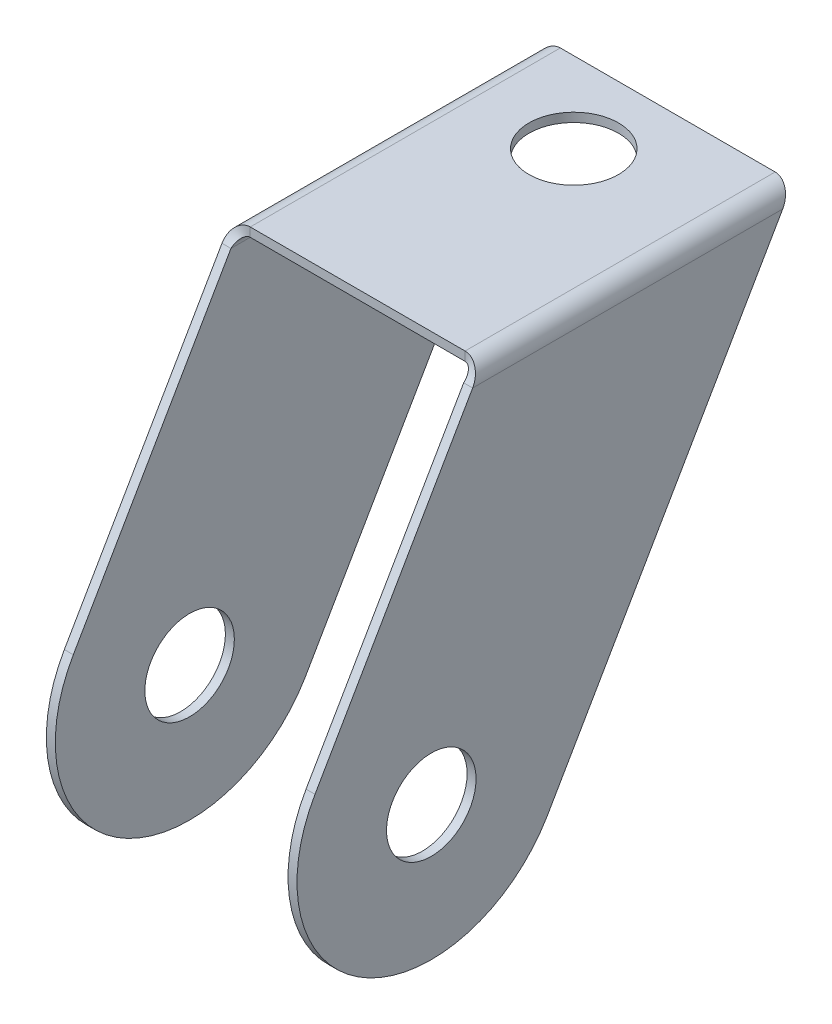
ISO-10303-21;
HEADER;
FILE_DESCRIPTION(('STEP AP214'),'2;1');
FILE_NAME('part.step','',(''),(''),'','','');
FILE_SCHEMA(('AUTOMOTIVE_DESIGN { 1 0 10303 214 1 1 1 1 }'));
ENDSEC;
DATA;
#1=APPLICATION_CONTEXT('core data for automotive mechanical design processes');
#2=APPLICATION_PROTOCOL_DEFINITION('international standard','automotive_design',2000,#1);
#3=PRODUCT_CONTEXT('',#1,'mechanical');
#4=PRODUCT('Part','Part','',(#3));
#5=PRODUCT_RELATED_PRODUCT_CATEGORY('part','',(#4));
#6=PRODUCT_DEFINITION_FORMATION('','',#4);
#7=PRODUCT_DEFINITION_CONTEXT('part definition',#1,'design');
#8=PRODUCT_DEFINITION('design','',#6,#7);
#9=PRODUCT_DEFINITION_SHAPE('','',#8);
#10=(LENGTH_UNIT() NAMED_UNIT(*) SI_UNIT(.MILLI.,.METRE.));
#11=(NAMED_UNIT(*) PLANE_ANGLE_UNIT() SI_UNIT($,.RADIAN.));
#12=(NAMED_UNIT(*) SI_UNIT($,.STERADIAN.) SOLID_ANGLE_UNIT());
#13=UNCERTAINTY_MEASURE_WITH_UNIT(LENGTH_MEASURE(1.E-05),#10,'distance_accuracy_value','');
#14=(GEOMETRIC_REPRESENTATION_CONTEXT(3) GLOBAL_UNCERTAINTY_ASSIGNED_CONTEXT((#13)) GLOBAL_UNIT_ASSIGNED_CONTEXT((#10,
#11,#12)) REPRESENTATION_CONTEXT('',''));
#15=CARTESIAN_POINT('',(0.,0.,0.));
#16=DIRECTION('',(0.,0.,1.));
#17=DIRECTION('',(1.,0.,0.));
#18=AXIS2_PLACEMENT_3D('',#15,#16,#17);
#19=CARTESIAN_POINT('',(28.,0.,34.64));
#20=DIRECTION('',(0.,0.,1.));
#21=DIRECTION('',(-1.,0.,0.));
#22=AXIS2_PLACEMENT_3D('',#19,#20,#21);
#23=PLANE('',#22);
#24=DIRECTION('',(0.,1.,0.));
#25=VECTOR('',#24,1.);
#26=CARTESIAN_POINT('',(2.,0.,34.64));
#27=LINE('',#26,#25);
#28=CARTESIAN_POINT('',(2.,-1.,34.64));
#29=VERTEX_POINT('',#28);
#30=CARTESIAN_POINT('',(2.,0.,34.64));
#31=VERTEX_POINT('',#30);
#32=EDGE_CURVE('E11',#29,#31,#27,.T.);
#33=ORIENTED_EDGE('',*,*,#32,.F.);
#34=DIRECTION('',(1.,0.,0.));
#35=VECTOR('',#34,1.);
#36=CARTESIAN_POINT('',(28.,-1.,34.64));
#37=LINE('',#36,#35);
#38=CARTESIAN_POINT('',(26.,-1.,34.64));
#39=VERTEX_POINT('',#38);
#40=EDGE_CURVE('E96',#39,#29,#37,.F.);
#41=ORIENTED_EDGE('',*,*,#40,.F.);
#42=DIRECTION('',(0.,1.,0.));
#43=VECTOR('',#42,1.);
#44=CARTESIAN_POINT('',(26.,0.,34.64));
#45=LINE('',#44,#43);
#46=CARTESIAN_POINT('',(26.,0.,34.64));
#47=VERTEX_POINT('',#46);
#48=EDGE_CURVE('E48',#39,#47,#45,.T.);
#49=ORIENTED_EDGE('',*,*,#48,.T.);
#50=DIRECTION('',(-1.,0.,0.));
#51=VECTOR('',#50,1.);
#52=CARTESIAN_POINT('',(28.,0.,34.64));
#53=LINE('',#52,#51);
#54=EDGE_CURVE('E98',#47,#31,#53,.T.);
#55=ORIENTED_EDGE('',*,*,#54,.T.);
#56=EDGE_LOOP('',(#33,#41,#49,#55));
#57=FACE_BOUND('',#56,.T.);
#58=ADVANCED_FACE('F38',(#57),#23,.T.);
#59=CARTESIAN_POINT('',(26.,-1.00000000000001,34.64));
#60=CARTESIAN_POINT('',(26.,-0.666666666666675,34.64));
#61=CARTESIAN_POINT('',(26.,-0.333333333333341,34.64));
#62=CARTESIAN_POINT('',(26.,0.,34.64));
#63=CARTESIAN_POINT('',(28.,-1.00000000000001,34.64));
#64=CARTESIAN_POINT('',(28.6666666666667,-0.666666666666675,34.64));
#65=CARTESIAN_POINT('',(29.3333333333333,-0.333333333333341,34.64));
#66=CARTESIAN_POINT('',(30.,0.,34.64));
#67=CARTESIAN_POINT('',(28.,-3.00000000000001,36.9494010767585));
#68=CARTESIAN_POINT('',(28.6666666666667,-3.33333333333334,36.9494010767585));
#69=CARTESIAN_POINT('',(29.3333333333333,-3.66666666666668,36.9494010767585));
#70=CARTESIAN_POINT('',(30.,-4.00000000000001,36.9494010767585));
#71=CARTESIAN_POINT('',(26.,-3.00000000000001,36.9494010767585));
#72=CARTESIAN_POINT('',(26.,-3.33333333333334,36.9494010767585));
#73=CARTESIAN_POINT('',(26.,-3.66666666666668,36.9494010767585));
#74=CARTESIAN_POINT('',(26.,-4.00000000000001,36.9494010767585));
#75=CARTESIAN_POINT('',(24.,-3.00000000000001,36.9494010767585));
#76=CARTESIAN_POINT('',(23.3333333333333,-3.33333333333334,36.9494010767585));
#77=CARTESIAN_POINT('',(22.6666666666667,-3.66666666666668,36.9494010767585));
#78=CARTESIAN_POINT('',(22.,-4.00000000000001,36.9494010767585));
#79=CARTESIAN_POINT('',(24.,-1.00000000000001,34.64));
#80=CARTESIAN_POINT('',(23.3333333333333,-0.666666666666675,34.64));
#81=CARTESIAN_POINT('',(22.6666666666667,-0.333333333333341,34.64));
#82=CARTESIAN_POINT('',(22.,0.,34.64));
#83=CARTESIAN_POINT('',(26.,-1.00000000000001,34.64));
#84=CARTESIAN_POINT('',(26.,-0.666666666666675,34.64));
#85=CARTESIAN_POINT('',(26.,-0.333333333333341,34.64));
#86=CARTESIAN_POINT('',(26.,0.,34.64));
#87=(BOUNDED_SURFACE() B_SPLINE_SURFACE(3,3,((#59,#60,#61,#62),(#63,#64,#65,#66),(#67,#68,#69,
#70),(#71,#72,#73,#74),(#75,#76,#77,#78),(#79,#80,#81,#82),(#83,#84,#85,#86)),.UNSPECIFIED.,.T.,
.F.,.F.) B_SPLINE_SURFACE_WITH_KNOTS((4,3,4),(4,4),(0.,0.5,1.),(0.,1.),
.UNSPECIFIED.) GEOMETRIC_REPRESENTATION_ITEM() RATIONAL_B_SPLINE_SURFACE(((1.,1.,1.,1.),
(0.333333333333333,0.333333333333333,0.333333333333333,0.333333333333333),(0.333333333333333,
0.333333333333333,0.333333333333333,0.333333333333333),(1.,1.,1.,1.),(0.333333333333333,
0.333333333333333,0.333333333333333,0.333333333333333),(0.333333333333333,0.333333333333333,
0.333333333333333,0.333333333333333),(1.,1.,1.,1.))) REPRESENTATION_ITEM('') SURFACE());
#88=CARTESIAN_POINT('',(26.,-2.00000000000001,35.7947005383793));
#89=DIRECTION('',(0.,-0.755928946018457,-0.654653670707975));
#90=DIRECTION('',(0.,0.654653670707975,-0.755928946018457));
#91=AXIS2_PLACEMENT_3D('',#88,#89,#90);
#92=ELLIPSE('',#91,1.52752523165195,1.);
#93=CARTESIAN_POINT('',(27.,-2.00000000000001,35.7947005383793));
#94=VERTEX_POINT('',#93);
#95=EDGE_CURVE('E139',#39,#94,#92,.T.);
#96=DIRECTION('',(1.,0.,0.));
#97=VECTOR('',#96,1.);
#98=CARTESIAN_POINT('',(28.,-2.00000000000001,35.7947005383793));
#99=LINE('',#98,#97);
#100=CARTESIAN_POINT('',(28.,-2.00000000000001,35.7947005383793));
#101=VERTEX_POINT('',#100);
#102=EDGE_CURVE('E172',#94,#101,#99,.T.);
#103=CARTESIAN_POINT('',(26.,-2.00000000000001,35.7947005383793));
#104=DIRECTION('',(0.,-0.500000000000004,-0.866025403784437));
#105=DIRECTION('',(0.,0.866025403784436,-0.500000000000004));
#106=AXIS2_PLACEMENT_3D('',#103,#104,#105);
#107=ELLIPSE('',#106,2.30940107675851,2.);
#108=EDGE_CURVE('E190',#47,#101,#107,.T.);
#109=ORIENTED_EDGE('',*,*,#48,.F.);
#110=ORIENTED_EDGE('',*,*,#95,.T.);
#111=ORIENTED_EDGE('',*,*,#102,.T.);
#112=ORIENTED_EDGE('',*,*,#108,.F.);
#113=EDGE_LOOP('',(#109,#110,#111,#112));
#114=FACE_BOUND('',#113,.T.);
#115=ADVANCED_FACE('F293',(#114),#87,.T.);
#116=CARTESIAN_POINT('',(28.,0.,34.64));
#117=DIRECTION('',(0.,0.500000000000004,0.866025403784437));
#118=DIRECTION('',(0.,-0.866025403784436,0.500000000000004));
#119=AXIS2_PLACEMENT_3D('',#116,#117,#118);
#120=PLANE('',#119);
#121=ORIENTED_EDGE('',*,*,#102,.F.);
#122=DIRECTION('',(0.,-0.866025403784436,0.500000000000004));
#123=VECTOR('',#122,1.);
#124=CARTESIAN_POINT('',(27.,0.,34.64));
#125=LINE('',#124,#123);
#126=CARTESIAN_POINT('',(27.,-32.5,53.403883748663));
#127=VERTEX_POINT('',#126);
#128=EDGE_CURVE('E213',#94,#127,#125,.T.);
#129=ORIENTED_EDGE('',*,*,#128,.T.);
#130=DIRECTION('',(1.,0.,0.));
#131=VECTOR('',#130,1.);
#132=CARTESIAN_POINT('',(28.,-32.5,53.403883748663));
#133=LINE('',#132,#131);
#134=CARTESIAN_POINT('',(28.,-32.5,53.403883748663));
#135=VERTEX_POINT('',#134);
#136=EDGE_CURVE('E169',#127,#135,#133,.T.);
#137=ORIENTED_EDGE('',*,*,#136,.T.);
#138=DIRECTION('',(0.,-0.866025403784436,0.500000000000004));
#139=VECTOR('',#138,1.);
#140=CARTESIAN_POINT('',(28.,0.,34.64));
#141=LINE('',#140,#139);
#142=EDGE_CURVE('E231',#101,#135,#141,.T.);
#143=ORIENTED_EDGE('',*,*,#142,.F.);
#144=EDGE_LOOP('',(#121,#129,#137,#143));
#145=FACE_BOUND('',#144,.T.);
#146=ADVANCED_FACE('F299',(#145),#120,.T.);
#147=CARTESIAN_POINT('',(28.,-40.,40.4135026918964));
#148=DIRECTION('',(1.,0.,0.));
#149=DIRECTION('',(0.,0.,-1.));
#150=AXIS2_PLACEMENT_3D('',#147,#148,#149);
#151=CYLINDRICAL_SURFACE('',#150,15.);
#152=ORIENTED_EDGE('',*,*,#136,.F.);
#153=CARTESIAN_POINT('',(27.,-40.,40.4135026918964));
#154=DIRECTION('',(1.,0.,0.));
#155=DIRECTION('',(0.,0.,-1.));
#156=AXIS2_PLACEMENT_3D('',#153,#154,#155);
#157=CIRCLE('',#156,15.);
#158=CARTESIAN_POINT('',(27.,-47.6402714344221,27.5051235369307));
#159=VERTEX_POINT('',#158);
#160=EDGE_CURVE('E148',#127,#159,#157,.T.);
#161=ORIENTED_EDGE('',*,*,#160,.T.);
#162=DIRECTION('',(1.,0.,0.));
#163=VECTOR('',#162,1.);
#164=CARTESIAN_POINT('',(28.,-47.6402714344223,27.5051235369309));
#165=LINE('',#164,#163);
#166=CARTESIAN_POINT('',(28.,-47.6402714344223,27.5051235369309));
#167=VERTEX_POINT('',#166);
#168=EDGE_CURVE('E166',#159,#167,#165,.T.);
#169=ORIENTED_EDGE('',*,*,#168,.T.);
#170=CARTESIAN_POINT('',(28.,-40.,40.4135026918964));
#171=DIRECTION('',(1.,0.,0.));
#172=DIRECTION('',(0.,0.,-1.));
#173=AXIS2_PLACEMENT_3D('',#170,#171,#172);
#174=CIRCLE('',#173,15.);
#175=EDGE_CURVE('E235',#135,#167,#174,.T.);
#176=ORIENTED_EDGE('',*,*,#175,.F.);
#177=EDGE_LOOP('',(#152,#161,#169,#176));
#178=FACE_BOUND('',#177,.T.);
#179=ADVANCED_FACE('F405',(#178),#151,.T.);
#180=CARTESIAN_POINT('',(28.,-47.6402714344223,27.5051235369309));
#181=DIRECTION('',(0.,-0.500000000000004,-0.866025403784436));
#182=DIRECTION('',(0.,0.866025403784436,-0.500000000000004));
#183=AXIS2_PLACEMENT_3D('',#180,#181,#182);
#184=PLANE('',#183);
#185=ORIENTED_EDGE('',*,*,#168,.F.);
#186=DIRECTION('',(0.,0.866025403784436,-0.500000000000004));
#187=VECTOR('',#186,1.);
#188=CARTESIAN_POINT('',(27.,-47.6402714344223,27.5051235369309));
#189=LINE('',#188,#187);
#190=CARTESIAN_POINT('',(27.,-1.99999999999999,1.15470053837925));
#191=VERTEX_POINT('',#190);
#192=EDGE_CURVE('E136',#159,#191,#189,.T.);
#193=ORIENTED_EDGE('',*,*,#192,.T.);
#194=DIRECTION('',(1.,0.,0.));
#195=VECTOR('',#194,1.);
#196=CARTESIAN_POINT('',(28.,-1.99999999999999,1.15470053837926));
#197=LINE('',#196,#195);
#198=CARTESIAN_POINT('',(28.,-1.99999999999999,1.15470053837926));
#199=VERTEX_POINT('',#198);
#200=EDGE_CURVE('E163',#191,#199,#197,.T.);
#201=ORIENTED_EDGE('',*,*,#200,.T.);
#202=DIRECTION('',(0.,0.866025403784436,-0.500000000000004));
#203=VECTOR('',#202,1.);
#204=CARTESIAN_POINT('',(28.,-47.6402714344223,27.5051235369309));
#205=LINE('',#204,#203);
#206=EDGE_CURVE('E228',#167,#199,#205,.T.);
#207=ORIENTED_EDGE('',*,*,#206,.F.);
#208=EDGE_LOOP('',(#185,#193,#201,#207));
#209=FACE_BOUND('',#208,.T.);
#210=ADVANCED_FACE('F397',(#209),#184,.T.);
#211=CARTESIAN_POINT('',(26.,0.,0.));
#212=CARTESIAN_POINT('',(26.,-0.333333333333337,0.));
#213=CARTESIAN_POINT('',(26.,-0.666666666666671,0.));
#214=CARTESIAN_POINT('',(26.,-1.,0.));
#215=CARTESIAN_POINT('',(22.,0.,0.));
#216=CARTESIAN_POINT('',(22.6666666666667,-0.333333333333337,0.));
#217=CARTESIAN_POINT('',(23.3333333333333,-0.666666666666671,0.));
#218=CARTESIAN_POINT('',(24.,-1.,0.));
#219=CARTESIAN_POINT('',(22.,-4.,2.30940107675853));
#220=CARTESIAN_POINT('',(22.6666666666667,-3.66666666666667,2.30940107675853));
#221=CARTESIAN_POINT('',(23.3333333333333,-3.33333333333334,2.30940107675853));
#222=CARTESIAN_POINT('',(24.,-3.,2.30940107675853));
#223=CARTESIAN_POINT('',(26.,-4.,2.30940107675853));
#224=CARTESIAN_POINT('',(26.,-3.66666666666667,2.30940107675853));
#225=CARTESIAN_POINT('',(26.,-3.33333333333334,2.30940107675853));
#226=CARTESIAN_POINT('',(26.,-3.,2.30940107675853));
#227=CARTESIAN_POINT('',(30.,-4.,2.30940107675853));
#228=CARTESIAN_POINT('',(29.3333333333333,-3.66666666666667,2.30940107675853));
#229=CARTESIAN_POINT('',(28.6666666666667,-3.33333333333334,2.30940107675853));
#230=CARTESIAN_POINT('',(28.,-3.,2.30940107675853));
#231=CARTESIAN_POINT('',(30.,0.,0.));
#232=CARTESIAN_POINT('',(29.3333333333333,-0.333333333333337,0.));
#233=CARTESIAN_POINT('',(28.6666666666667,-0.666666666666671,0.));
#234=CARTESIAN_POINT('',(28.,-1.,0.));
#235=CARTESIAN_POINT('',(26.,0.,0.));
#236=CARTESIAN_POINT('',(26.,-0.333333333333337,0.));
#237=CARTESIAN_POINT('',(26.,-0.666666666666671,0.));
#238=CARTESIAN_POINT('',(26.,-1.,0.));
#239=(BOUNDED_SURFACE() B_SPLINE_SURFACE(3,3,((#211,#212,#213,#214),(#215,#216,#217,#218),(#219,
#220,#221,#222),(#223,#224,#225,#226),(#227,#228,#229,#230),(#231,#232,#233,#234),(#235,#236,
#237,#238)),.UNSPECIFIED.,.T.,.F.,.F.) B_SPLINE_SURFACE_WITH_KNOTS((4,3,4),(4,4),(0.,0.5,1.),
(0.,1.),.UNSPECIFIED.) GEOMETRIC_REPRESENTATION_ITEM() RATIONAL_B_SPLINE_SURFACE(((1.,1.,1.,1.),
(0.333333333333333,0.333333333333333,0.333333333333333,0.333333333333333),(0.333333333333333,
0.333333333333333,0.333333333333333,0.333333333333333),(1.,1.,1.,1.),(0.333333333333333,
0.333333333333333,0.333333333333333,0.333333333333333),(0.333333333333333,0.333333333333333,
0.333333333333333,0.333333333333333),(1.,1.,1.,1.))) REPRESENTATION_ITEM('') SURFACE());
#240=CARTESIAN_POINT('',(26.,-2.,1.15470053837927));
#241=DIRECTION('',(0.,-0.755928946018459,-0.654653670707973));
#242=DIRECTION('',(0.,0.654653670707973,-0.755928946018458));
#243=AXIS2_PLACEMENT_3D('',#240,#241,#242);
#244=ELLIPSE('',#243,1.52752523165196,1.);
#245=CARTESIAN_POINT('',(26.,-1.,0.));
#246=VERTEX_POINT('',#245);
#247=EDGE_CURVE('E134',#191,#246,#244,.F.);
#248=DIRECTION('',(0.,1.,0.));
#249=VECTOR('',#248,1.);
#250=CARTESIAN_POINT('',(26.,0.,0.));
#251=LINE('',#250,#249);
#252=CARTESIAN_POINT('',(26.,0.,0.));
#253=VERTEX_POINT('',#252);
#254=EDGE_CURVE('E161',#246,#253,#251,.T.);
#255=CARTESIAN_POINT('',(26.,-2.,1.15470053837927));
#256=DIRECTION('',(0.,-0.500000000000004,-0.866025403784436));
#257=DIRECTION('',(0.,0.866025403784436,-0.500000000000004));
#258=AXIS2_PLACEMENT_3D('',#255,#256,#257);
#259=ELLIPSE('',#258,2.30940107675851,2.);
#260=EDGE_CURVE('E193',#199,#253,#259,.F.);
#261=ORIENTED_EDGE('',*,*,#200,.F.);
#262=ORIENTED_EDGE('',*,*,#247,.T.);
#263=ORIENTED_EDGE('',*,*,#254,.T.);
#264=ORIENTED_EDGE('',*,*,#260,.F.);
#265=EDGE_LOOP('',(#261,#262,#263,#264));
#266=FACE_BOUND('',#265,.T.);
#267=ADVANCED_FACE('F308',(#266),#239,.F.);
#268=CARTESIAN_POINT('',(28.,0.,0.));
#269=DIRECTION('',(0.,0.,1.));
#270=DIRECTION('',(-1.,0.,0.));
#271=AXIS2_PLACEMENT_3D('',#268,#269,#270);
#272=PLANE('',#271);
#273=ORIENTED_EDGE('',*,*,#254,.F.);
#274=DIRECTION('',(1.,0.,0.));
#275=VECTOR('',#274,1.);
#276=CARTESIAN_POINT('',(28.,-1.,0.));
#277=LINE('',#276,#275);
#278=CARTESIAN_POINT('',(2.,-1.,0.));
#279=VERTEX_POINT('',#278);
#280=EDGE_CURVE('E126',#246,#279,#277,.F.);
#281=ORIENTED_EDGE('',*,*,#280,.T.);
#282=DIRECTION('',(0.,1.,0.));
#283=VECTOR('',#282,1.);
#284=CARTESIAN_POINT('',(2.,0.,0.));
#285=LINE('',#284,#283);
#286=CARTESIAN_POINT('',(2.,0.,0.));
#287=VERTEX_POINT('',#286);
#288=EDGE_CURVE('E158',#279,#287,#285,.T.);
#289=ORIENTED_EDGE('',*,*,#288,.T.);
#290=DIRECTION('',(-1.,0.,0.));
#291=VECTOR('',#290,1.);
#292=CARTESIAN_POINT('',(28.,0.,0.));
#293=LINE('',#292,#291);
#294=EDGE_CURVE('E242',#253,#287,#293,.T.);
#295=ORIENTED_EDGE('',*,*,#294,.F.);
#296=EDGE_LOOP('',(#273,#281,#289,#295));
#297=FACE_BOUND('',#296,.T.);
#298=ADVANCED_FACE('F312',(#297),#272,.F.);
#299=CARTESIAN_POINT('',(2.,-3.,2.30940107675853));
#300=CARTESIAN_POINT('',(2.,-3.33333333333333,2.30940107675853));
#301=CARTESIAN_POINT('',(2.,-3.66666666666667,2.30940107675853));
#302=CARTESIAN_POINT('',(2.,-4.,2.30940107675853));
#303=CARTESIAN_POINT('',(4.,-3.,2.30940107675853));
#304=CARTESIAN_POINT('',(4.66666666666667,-3.33333333333333,2.30940107675853));
#305=CARTESIAN_POINT('',(5.33333333333333,-3.66666666666667,2.30940107675853));
#306=CARTESIAN_POINT('',(6.,-4.,2.30940107675853));
#307=CARTESIAN_POINT('',(4.,-1.,0.));
#308=CARTESIAN_POINT('',(4.66666666666667,-0.666666666666667,0.));
#309=CARTESIAN_POINT('',(5.33333333333333,-0.333333333333334,0.));
#310=CARTESIAN_POINT('',(6.,0.,0.));
#311=CARTESIAN_POINT('',(2.,-1.,0.));
#312=CARTESIAN_POINT('',(2.,-0.666666666666667,0.));
#313=CARTESIAN_POINT('',(2.,-0.333333333333333,0.));
#314=CARTESIAN_POINT('',(2.,0.,0.));
#315=CARTESIAN_POINT('',(0.,-1.,0.));
#316=CARTESIAN_POINT('',(-0.666666666666669,-0.666666666666666,0.));
#317=CARTESIAN_POINT('',(-1.33333333333334,-0.333333333333333,0.));
#318=CARTESIAN_POINT('',(-2.,0.,0.));
#319=CARTESIAN_POINT('',(0.,-3.,2.30940107675853));
#320=CARTESIAN_POINT('',(-0.666666666666669,-3.33333333333333,2.30940107675853));
#321=CARTESIAN_POINT('',(-1.33333333333334,-3.66666666666667,2.30940107675853));
#322=CARTESIAN_POINT('',(-2.,-4.,2.30940107675853));
#323=CARTESIAN_POINT('',(2.,-3.,2.30940107675853));
#324=CARTESIAN_POINT('',(2.,-3.33333333333333,2.30940107675853));
#325=CARTESIAN_POINT('',(2.,-3.66666666666667,2.30940107675853));
#326=CARTESIAN_POINT('',(2.,-4.,2.30940107675853));
#327=(BOUNDED_SURFACE() B_SPLINE_SURFACE(3,3,((#299,#300,#301,#302),(#303,#304,#305,#306),(#307,
#308,#309,#310),(#311,#312,#313,#314),(#315,#316,#317,#318),(#319,#320,#321,#322),(#323,#324,
#325,#326)),.UNSPECIFIED.,.T.,.F.,.F.) B_SPLINE_SURFACE_WITH_KNOTS((4,3,4),(4,4),(0.,0.5,1.),
(0.,1.),.UNSPECIFIED.) GEOMETRIC_REPRESENTATION_ITEM() RATIONAL_B_SPLINE_SURFACE(((1.,1.,1.,1.),
(0.333333333333333,0.333333333333333,0.333333333333333,0.333333333333333),(0.333333333333333,
0.333333333333333,0.333333333333333,0.333333333333333),(1.,1.,1.,1.),(0.333333333333333,
0.333333333333333,0.333333333333333,0.333333333333333),(0.333333333333333,0.333333333333333,
0.333333333333333,0.333333333333333),(1.,1.,1.,1.))) REPRESENTATION_ITEM('') SURFACE());
#328=CARTESIAN_POINT('',(2.,-2.,1.15470053837926));
#329=DIRECTION('',(0.,0.755928946018458,0.654653670707973));
#330=DIRECTION('',(0.,-0.654653670707973,0.755928946018458));
#331=AXIS2_PLACEMENT_3D('',#328,#329,#330);
#332=ELLIPSE('',#331,1.52752523165196,1.);
#333=CARTESIAN_POINT('',(0.999999999999998,-1.99999999999999,1.15470053837926));
#334=VERTEX_POINT('',#333);
#335=EDGE_CURVE('E114',#279,#334,#332,.T.);
#336=DIRECTION('',(-1.,0.,0.));
#337=VECTOR('',#336,1.);
#338=CARTESIAN_POINT('',(0.,-1.99999999999999,1.15470053837926));
#339=LINE('',#338,#337);
#340=CARTESIAN_POINT('',(0.,-1.99999999999999,1.15470053837926));
#341=VERTEX_POINT('',#340);
#342=EDGE_CURVE('E155',#334,#341,#339,.T.);
#343=CARTESIAN_POINT('',(2.,-2.,1.15470053837926));
#344=DIRECTION('',(0.,0.500000000000004,0.866025403784436));
#345=DIRECTION('',(0.,-0.866025403784436,0.500000000000004));
#346=AXIS2_PLACEMENT_3D('',#343,#344,#345);
#347=ELLIPSE('',#346,2.30940107675851,2.);
#348=EDGE_CURVE('E232',#287,#341,#347,.T.);
#349=ORIENTED_EDGE('',*,*,#288,.F.);
#350=ORIENTED_EDGE('',*,*,#335,.T.);
#351=ORIENTED_EDGE('',*,*,#342,.T.);
#352=ORIENTED_EDGE('',*,*,#348,.F.);
#353=EDGE_LOOP('',(#349,#350,#351,#352));
#354=FACE_BOUND('',#353,.T.);
#355=ADVANCED_FACE('F381',(#354),#327,.T.);
#356=CARTESIAN_POINT('',(0.,-47.6402714344223,27.5051235369309));
#357=DIRECTION('',(0.,-0.500000000000004,-0.866025403784436));
#358=DIRECTION('',(0.,0.866025403784436,-0.500000000000004));
#359=AXIS2_PLACEMENT_3D('',#356,#357,#358);
#360=PLANE('',#359);
#361=ORIENTED_EDGE('',*,*,#342,.F.);
#362=DIRECTION('',(0.,0.866025403784436,-0.500000000000004));
#363=VECTOR('',#362,1.);
#364=CARTESIAN_POINT('',(1.,-47.6402714344223,27.5051235369309));
#365=LINE('',#364,#363);
#366=CARTESIAN_POINT('',(1.,-47.6402714344221,27.5051235369307));
#367=VERTEX_POINT('',#366);
#368=EDGE_CURVE('E207',#367,#334,#365,.T.);
#369=ORIENTED_EDGE('',*,*,#368,.F.);
#370=DIRECTION('',(-1.,0.,0.));
#371=VECTOR('',#370,1.);
#372=CARTESIAN_POINT('',(0.,-47.6402714344223,27.5051235369309));
#373=LINE('',#372,#371);
#374=CARTESIAN_POINT('',(0.,-47.6402714344223,27.5051235369309));
#375=VERTEX_POINT('',#374);
#376=EDGE_CURVE('E152',#367,#375,#373,.T.);
#377=ORIENTED_EDGE('',*,*,#376,.T.);
#378=DIRECTION('',(0.,0.866025403784436,-0.500000000000004));
#379=VECTOR('',#378,1.);
#380=CARTESIAN_POINT('',(0.,-47.6402714344223,27.5051235369309));
#381=LINE('',#380,#379);
#382=EDGE_CURVE('E244',#375,#341,#381,.T.);
#383=ORIENTED_EDGE('',*,*,#382,.T.);
#384=EDGE_LOOP('',(#361,#369,#377,#383));
#385=FACE_BOUND('',#384,.T.);
#386=ADVANCED_FACE('F271',(#385),#360,.T.);
#387=CARTESIAN_POINT('',(0.,-40.,40.4135026918964));
#388=DIRECTION('',(1.,0.,0.));
#389=DIRECTION('',(0.,0.,-1.));
#390=AXIS2_PLACEMENT_3D('',#387,#388,#389);
#391=CYLINDRICAL_SURFACE('',#390,15.);
#392=ORIENTED_EDGE('',*,*,#376,.F.);
#393=CARTESIAN_POINT('',(1.,-40.,40.4135026918964));
#394=DIRECTION('',(1.,0.,0.));
#395=DIRECTION('',(0.,0.,-1.));
#396=AXIS2_PLACEMENT_3D('',#393,#394,#395);
#397=CIRCLE('',#396,15.);
#398=CARTESIAN_POINT('',(1.,-32.5,53.403883748663));
#399=VERTEX_POINT('',#398);
#400=EDGE_CURVE('E204',#399,#367,#397,.T.);
#401=ORIENTED_EDGE('',*,*,#400,.F.);
#402=DIRECTION('',(-1.,0.,0.));
#403=VECTOR('',#402,1.);
#404=CARTESIAN_POINT('',(0.,-32.5,53.403883748663));
#405=LINE('',#404,#403);
#406=CARTESIAN_POINT('',(0.,-32.5,53.403883748663));
#407=VERTEX_POINT('',#406);
#408=EDGE_CURVE('E149',#399,#407,#405,.T.);
#409=ORIENTED_EDGE('',*,*,#408,.T.);
#410=CARTESIAN_POINT('',(0.,-40.,40.4135026918964));
#411=DIRECTION('',(1.,0.,0.));
#412=DIRECTION('',(0.,0.,-1.));
#413=AXIS2_PLACEMENT_3D('',#410,#411,#412);
#414=CIRCLE('',#413,15.);
#415=EDGE_CURVE('E247',#407,#375,#414,.T.);
#416=ORIENTED_EDGE('',*,*,#415,.T.);
#417=EDGE_LOOP('',(#392,#401,#409,#416));
#418=FACE_BOUND('',#417,.T.);
#419=ADVANCED_FACE('F376',(#418),#391,.T.);
#420=CARTESIAN_POINT('',(0.,0.,34.64));
#421=DIRECTION('',(0.,0.500000000000004,0.866025403784437));
#422=DIRECTION('',(0.,-0.866025403784436,0.500000000000004));
#423=AXIS2_PLACEMENT_3D('',#420,#421,#422);
#424=PLANE('',#423);
#425=ORIENTED_EDGE('',*,*,#408,.F.);
#426=DIRECTION('',(0.,-0.866025403784436,0.500000000000004));
#427=VECTOR('',#426,1.);
#428=CARTESIAN_POINT('',(1.,0.,34.64));
#429=LINE('',#428,#427);
#430=CARTESIAN_POINT('',(1.,-2.00000000000001,35.7947005383793));
#431=VERTEX_POINT('',#430);
#432=EDGE_CURVE('E145',#431,#399,#429,.T.);
#433=ORIENTED_EDGE('',*,*,#432,.F.);
#434=DIRECTION('',(-1.,0.,0.));
#435=VECTOR('',#434,1.);
#436=CARTESIAN_POINT('',(0.,-2.00000000000001,35.7947005383793));
#437=LINE('',#436,#435);
#438=CARTESIAN_POINT('',(0.,-2.00000000000001,35.7947005383793));
#439=VERTEX_POINT('',#438);
#440=EDGE_CURVE('E132',#431,#439,#437,.T.);
#441=ORIENTED_EDGE('',*,*,#440,.T.);
#442=DIRECTION('',(0.,-0.866025403784436,0.500000000000004));
#443=VECTOR('',#442,1.);
#444=CARTESIAN_POINT('',(0.,0.,34.64));
#445=LINE('',#444,#443);
#446=EDGE_CURVE('E250',#439,#407,#445,.T.);
#447=ORIENTED_EDGE('',*,*,#446,.T.);
#448=EDGE_LOOP('',(#425,#433,#441,#447));
#449=FACE_BOUND('',#448,.T.);
#450=ADVANCED_FACE('F282',(#449),#424,.T.);
#451=CARTESIAN_POINT('',(28.,-40.,40.4135026918964));
#452=DIRECTION('',(1.,0.,0.));
#453=DIRECTION('',(0.,0.,-1.));
#454=AXIS2_PLACEMENT_3D('',#451,#452,#453);
#455=CYLINDRICAL_SURFACE('',#454,5.00000000000001);
#456=CARTESIAN_POINT('',(28.,-40.,40.4135026918964));
#457=DIRECTION('',(1.,0.,0.));
#458=DIRECTION('',(0.,0.,-1.));
#459=AXIS2_PLACEMENT_3D('',#456,#457,#458);
#460=CIRCLE('',#459,5.00000000000001);
#461=CARTESIAN_POINT('',(28.,-40.,35.4135026918964));
#462=VERTEX_POINT('',#461);
#463=EDGE_CURVE('E238',#462,#462,#460,.T.);
#464=ORIENTED_EDGE('',*,*,#463,.T.);
#465=EDGE_LOOP('',(#464));
#466=FACE_BOUND('',#465,.T.);
#467=CARTESIAN_POINT('',(27.,-40.,40.4135026918964));
#468=DIRECTION('',(1.,0.,0.));
#469=DIRECTION('',(0.,0.,-1.));
#470=AXIS2_PLACEMENT_3D('',#467,#468,#469);
#471=CIRCLE('',#470,5.00000000000001);
#472=CARTESIAN_POINT('',(27.,-40.,35.4135026918964));
#473=VERTEX_POINT('',#472);
#474=EDGE_CURVE('E127',#473,#473,#471,.T.);
#475=ORIENTED_EDGE('',*,*,#474,.F.);
#476=EDGE_LOOP('',(#475));
#477=FACE_BOUND('',#476,.T.);
#478=ADVANCED_FACE('F40',(#466,#477),#455,.F.);
#479=CARTESIAN_POINT('',(2.,-4.,36.9494010767585));
#480=CARTESIAN_POINT('',(2.,-3.66666666666667,36.9494010767585));
#481=CARTESIAN_POINT('',(2.,-3.33333333333334,36.9494010767585));
#482=CARTESIAN_POINT('',(2.,-3.,36.9494010767585));
#483=CARTESIAN_POINT('',(-2.,-4.,36.9494010767585));
#484=CARTESIAN_POINT('',(-1.33333333333334,-3.66666666666667,36.9494010767585));
#485=CARTESIAN_POINT('',(-0.666666666666668,-3.33333333333334,36.9494010767585));
#486=CARTESIAN_POINT('',(0.,-3.,36.9494010767585));
#487=CARTESIAN_POINT('',(-2.,0.,34.64));
#488=CARTESIAN_POINT('',(-1.33333333333334,-0.333333333333337,34.64));
#489=CARTESIAN_POINT('',(-0.666666666666668,-0.666666666666671,34.64));
#490=CARTESIAN_POINT('',(0.,-1.,34.64));
#491=CARTESIAN_POINT('',(2.,0.,34.64));
#492=CARTESIAN_POINT('',(2.,-0.333333333333338,34.64));
#493=CARTESIAN_POINT('',(2.,-0.666666666666671,34.64));
#494=CARTESIAN_POINT('',(2.,-1.,34.64));
#495=CARTESIAN_POINT('',(6.,0.,34.64));
#496=CARTESIAN_POINT('',(5.33333333333333,-0.333333333333338,34.64));
#497=CARTESIAN_POINT('',(4.66666666666667,-0.666666666666672,34.64));
#498=CARTESIAN_POINT('',(4.,-1.,34.64));
#499=CARTESIAN_POINT('',(6.,-4.,36.9494010767585));
#500=CARTESIAN_POINT('',(5.33333333333333,-3.66666666666667,36.9494010767585));
#501=CARTESIAN_POINT('',(4.66666666666667,-3.33333333333334,36.9494010767585));
#502=CARTESIAN_POINT('',(4.,-3.,36.9494010767585));
#503=CARTESIAN_POINT('',(2.,-4.,36.9494010767585));
#504=CARTESIAN_POINT('',(2.,-3.66666666666667,36.9494010767585));
#505=CARTESIAN_POINT('',(2.,-3.33333333333334,36.9494010767585));
#506=CARTESIAN_POINT('',(2.,-3.,36.9494010767585));
#507=(BOUNDED_SURFACE() B_SPLINE_SURFACE(3,3,((#479,#480,#481,#482),(#483,#484,#485,#486),(#487,
#488,#489,#490),(#491,#492,#493,#494),(#495,#496,#497,#498),(#499,#500,#501,#502),(#503,#504,
#505,#506)),.UNSPECIFIED.,.T.,.F.,.F.) B_SPLINE_SURFACE_WITH_KNOTS((4,3,4),(4,4),(0.,0.5,1.),
(0.,1.),.UNSPECIFIED.) GEOMETRIC_REPRESENTATION_ITEM() RATIONAL_B_SPLINE_SURFACE(((1.,1.,1.,1.),
(0.333333333333333,0.333333333333333,0.333333333333333,0.333333333333333),(0.333333333333333,
0.333333333333333,0.333333333333333,0.333333333333333),(1.,1.,1.,1.),(0.333333333333333,
0.333333333333333,0.333333333333333,0.333333333333333),(0.333333333333333,0.333333333333333,
0.333333333333333,0.333333333333333),(1.,1.,1.,1.))) REPRESENTATION_ITEM('') SURFACE());
#508=CARTESIAN_POINT('',(2.,-2.,35.7947005383793));
#509=DIRECTION('',(0.,0.755928946018457,0.654653670707975));
#510=DIRECTION('',(0.,-0.654653670707975,0.755928946018457));
#511=AXIS2_PLACEMENT_3D('',#508,#509,#510);
#512=ELLIPSE('',#511,1.52752523165195,1.);
#513=EDGE_CURVE('E111',#431,#29,#512,.F.);
#514=CARTESIAN_POINT('',(2.,-2.,35.7947005383793));
#515=DIRECTION('',(0.,0.500000000000004,0.866025403784437));
#516=DIRECTION('',(0.,-0.866025403784436,0.500000000000004));
#517=AXIS2_PLACEMENT_3D('',#514,#515,#516);
#518=ELLIPSE('',#517,2.30940107675851,2.);
#519=EDGE_CURVE('E196',#439,#31,#518,.F.);
#520=ORIENTED_EDGE('',*,*,#513,.T.);
#521=ORIENTED_EDGE('',*,*,#32,.T.);
#522=ORIENTED_EDGE('',*,*,#519,.F.);
#523=ORIENTED_EDGE('',*,*,#440,.F.);
#524=EDGE_LOOP('',(#520,#521,#522,#523));
#525=FACE_BOUND('',#524,.T.);
#526=ADVANCED_FACE('F130',(#525),#507,.F.);
#527=CARTESIAN_POINT('',(0.,-40.,40.4135026918964));
#528=DIRECTION('',(1.,0.,0.));
#529=DIRECTION('',(0.,0.,-1.));
#530=AXIS2_PLACEMENT_3D('',#527,#528,#529);
#531=CYLINDRICAL_SURFACE('',#530,5.00000000000001);
#532=CARTESIAN_POINT('',(0.,-40.,40.4135026918964));
#533=DIRECTION('',(1.,0.,0.));
#534=DIRECTION('',(0.,0.,-1.));
#535=AXIS2_PLACEMENT_3D('',#532,#533,#534);
#536=CIRCLE('',#535,5.00000000000001);
#537=CARTESIAN_POINT('',(0.,-40.,35.4135026918964));
#538=VERTEX_POINT('',#537);
#539=EDGE_CURVE('E252',#538,#538,#536,.T.);
#540=ORIENTED_EDGE('',*,*,#539,.F.);
#541=EDGE_LOOP('',(#540));
#542=FACE_BOUND('',#541,.T.);
#543=CARTESIAN_POINT('',(1.,-40.,40.4135026918964));
#544=DIRECTION('',(1.,0.,0.));
#545=DIRECTION('',(0.,0.,-1.));
#546=AXIS2_PLACEMENT_3D('',#543,#544,#545);
#547=CIRCLE('',#546,5.00000000000001);
#548=CARTESIAN_POINT('',(1.,-40.,35.4135026918964));
#549=VERTEX_POINT('',#548);
#550=EDGE_CURVE('E119',#549,#549,#547,.T.);
#551=ORIENTED_EDGE('',*,*,#550,.T.);
#552=EDGE_LOOP('',(#551));
#553=FACE_BOUND('',#552,.T.);
#554=ADVANCED_FACE('F322',(#542,#553),#531,.F.);
#555=CARTESIAN_POINT('',(0.,-40.,40.4135026918964));
#556=DIRECTION('',(1.,0.,0.));
#557=DIRECTION('',(0.,0.,-1.));
#558=AXIS2_PLACEMENT_3D('',#555,#556,#557);
#559=PLANE('',#558);
#560=ORIENTED_EDGE('',*,*,#446,.F.);
#561=DIRECTION('',(0.,0.,1.));
#562=VECTOR('',#561,1.);
#563=CARTESIAN_POINT('',(0.,-2.00000000000001,40.4135026918965));
#564=LINE('',#563,#562);
#565=EDGE_CURVE('E186',#439,#341,#564,.F.);
#566=ORIENTED_EDGE('',*,*,#565,.T.);
#567=ORIENTED_EDGE('',*,*,#382,.F.);
#568=ORIENTED_EDGE('',*,*,#415,.F.);
#569=EDGE_LOOP('',(#560,#566,#567,#568));
#570=FACE_BOUND('',#569,.T.);
#571=ORIENTED_EDGE('',*,*,#539,.T.);
#572=EDGE_LOOP('',(#571));
#573=FACE_BOUND('',#572,.T.);
#574=ADVANCED_FACE('F277',(#570,#573),#559,.F.);
#575=CARTESIAN_POINT('',(28.,0.,0.));
#576=DIRECTION('',(0.,-1.,0.));
#577=DIRECTION('',(0.,0.,-1.));
#578=AXIS2_PLACEMENT_3D('',#575,#576,#577);
#579=PLANE('',#578);
#580=CARTESIAN_POINT('',(12.5,0.,9.));
#581=DIRECTION('',(0.,1.,0.));
#582=DIRECTION('',(0.,0.,1.));
#583=AXIS2_PLACEMENT_3D('',#580,#581,#582);
#584=CIRCLE('',#583,5.);
#585=CARTESIAN_POINT('',(12.5,0.,14.));
#586=VERTEX_POINT('',#585);
#587=EDGE_CURVE('E220',#586,#586,#584,.T.);
#588=ORIENTED_EDGE('',*,*,#587,.F.);
#589=EDGE_LOOP('',(#588));
#590=FACE_BOUND('',#589,.T.);
#591=ORIENTED_EDGE('',*,*,#54,.F.);
#592=DIRECTION('',(0.,0.,1.));
#593=VECTOR('',#592,1.);
#594=CARTESIAN_POINT('',(26.,0.,0.));
#595=LINE('',#594,#593);
#596=EDGE_CURVE('E175',#47,#253,#595,.F.);
#597=ORIENTED_EDGE('',*,*,#596,.T.);
#598=ORIENTED_EDGE('',*,*,#294,.T.);
#599=DIRECTION('',(0.,0.,1.));
#600=VECTOR('',#599,1.);
#601=CARTESIAN_POINT('',(2.,0.,0.));
#602=LINE('',#601,#600);
#603=EDGE_CURVE('E255',#287,#31,#602,.T.);
#604=ORIENTED_EDGE('',*,*,#603,.T.);
#605=EDGE_LOOP('',(#591,#597,#598,#604));
#606=FACE_BOUND('',#605,.T.);
#607=ADVANCED_FACE('F313',(#590,#606),#579,.F.);
#608=CARTESIAN_POINT('',(28.,-40.,40.4135026918964));
#609=DIRECTION('',(1.,0.,0.));
#610=DIRECTION('',(0.,0.,-1.));
#611=AXIS2_PLACEMENT_3D('',#608,#609,#610);
#612=PLANE('',#611);
#613=ORIENTED_EDGE('',*,*,#206,.T.);
#614=DIRECTION('',(0.,0.,1.));
#615=VECTOR('',#614,1.);
#616=CARTESIAN_POINT('',(28.,-2.00000000000001,34.64));
#617=LINE('',#616,#615);
#618=EDGE_CURVE('E180',#199,#101,#617,.T.);
#619=ORIENTED_EDGE('',*,*,#618,.T.);
#620=ORIENTED_EDGE('',*,*,#142,.T.);
#621=ORIENTED_EDGE('',*,*,#175,.T.);
#622=EDGE_LOOP('',(#613,#619,#620,#621));
#623=FACE_BOUND('',#622,.T.);
#624=ORIENTED_EDGE('',*,*,#463,.F.);
#625=EDGE_LOOP('',(#624));
#626=FACE_BOUND('',#625,.T.);
#627=ADVANCED_FACE('F302',(#623,#626),#612,.T.);
#628=CARTESIAN_POINT('',(2.,-2.,0.));
#629=DIRECTION('',(0.,0.,1.));
#630=DIRECTION('',(0.,-1.,0.));
#631=AXIS2_PLACEMENT_3D('',#628,#629,#630);
#632=CYLINDRICAL_SURFACE('',#631,2.);
#633=ORIENTED_EDGE('',*,*,#348,.T.);
#634=ORIENTED_EDGE('',*,*,#565,.F.);
#635=ORIENTED_EDGE('',*,*,#519,.T.);
#636=ORIENTED_EDGE('',*,*,#603,.F.);
#637=EDGE_LOOP('',(#633,#634,#635,#636));
#638=FACE_BOUND('',#637,.T.);
#639=ADVANCED_FACE('F265',(#638),#632,.T.);
#640=CARTESIAN_POINT('',(26.,-2.00000000000001,40.4135026918965));
#641=DIRECTION('',(0.,0.,-1.));
#642=DIRECTION('',(0.,1.,0.));
#643=AXIS2_PLACEMENT_3D('',#640,#641,#642);
#644=CYLINDRICAL_SURFACE('',#643,2.);
#645=ORIENTED_EDGE('',*,*,#260,.T.);
#646=ORIENTED_EDGE('',*,*,#596,.F.);
#647=ORIENTED_EDGE('',*,*,#108,.T.);
#648=ORIENTED_EDGE('',*,*,#618,.F.);
#649=EDGE_LOOP('',(#645,#646,#647,#648));
#650=FACE_BOUND('',#649,.T.);
#651=ADVANCED_FACE('F298',(#650),#644,.T.);
#652=CARTESIAN_POINT('',(1.,-40.,40.4135026918964));
#653=DIRECTION('',(1.,0.,0.));
#654=DIRECTION('',(0.,0.,-1.));
#655=AXIS2_PLACEMENT_3D('',#652,#653,#654);
#656=PLANE('',#655);
#657=ORIENTED_EDGE('',*,*,#432,.T.);
#658=ORIENTED_EDGE('',*,*,#400,.T.);
#659=ORIENTED_EDGE('',*,*,#368,.T.);
#660=DIRECTION('',(0.,0.,-1.));
#661=VECTOR('',#660,1.);
#662=CARTESIAN_POINT('',(1.,-2.00000000000001,40.4135026918964));
#663=LINE('',#662,#661);
#664=EDGE_CURVE('E118',#431,#334,#663,.T.);
#665=ORIENTED_EDGE('',*,*,#664,.F.);
#666=EDGE_LOOP('',(#657,#658,#659,#665));
#667=FACE_BOUND('',#666,.T.);
#668=ORIENTED_EDGE('',*,*,#550,.F.);
#669=EDGE_LOOP('',(#668));
#670=FACE_BOUND('',#669,.T.);
#671=ADVANCED_FACE('F350',(#667,#670),#656,.T.);
#672=CARTESIAN_POINT('',(28.,-1.,0.));
#673=DIRECTION('',(0.,-1.,0.));
#674=DIRECTION('',(0.,0.,-1.));
#675=AXIS2_PLACEMENT_3D('',#672,#673,#674);
#676=PLANE('',#675);
#677=CARTESIAN_POINT('',(12.5,-1.,9.));
#678=DIRECTION('',(0.,-1.,0.));
#679=DIRECTION('',(0.,0.,-1.));
#680=AXIS2_PLACEMENT_3D('',#677,#678,#679);
#681=CIRCLE('',#680,5.);
#682=CARTESIAN_POINT('',(12.5,-1.,4.));
#683=VERTEX_POINT('',#682);
#684=EDGE_CURVE('E42',#683,#683,#681,.T.);
#685=ORIENTED_EDGE('',*,*,#684,.F.);
#686=EDGE_LOOP('',(#685));
#687=FACE_BOUND('',#686,.T.);
#688=ORIENTED_EDGE('',*,*,#40,.T.);
#689=DIRECTION('',(0.,0.,-1.));
#690=VECTOR('',#689,1.);
#691=CARTESIAN_POINT('',(2.,-1.,0.));
#692=LINE('',#691,#690);
#693=EDGE_CURVE('E108',#279,#29,#692,.F.);
#694=ORIENTED_EDGE('',*,*,#693,.F.);
#695=ORIENTED_EDGE('',*,*,#280,.F.);
#696=DIRECTION('',(0.,0.,-1.));
#697=VECTOR('',#696,1.);
#698=CARTESIAN_POINT('',(26.,-1.,0.));
#699=LINE('',#698,#697);
#700=EDGE_CURVE('E124',#39,#246,#699,.T.);
#701=ORIENTED_EDGE('',*,*,#700,.F.);
#702=EDGE_LOOP('',(#688,#694,#695,#701));
#703=FACE_BOUND('',#702,.T.);
#704=ADVANCED_FACE('F122',(#687,#703),#676,.T.);
#705=CARTESIAN_POINT('',(27.,-40.,40.4135026918964));
#706=DIRECTION('',(1.,0.,0.));
#707=DIRECTION('',(0.,0.,-1.));
#708=AXIS2_PLACEMENT_3D('',#705,#706,#707);
#709=PLANE('',#708);
#710=ORIENTED_EDGE('',*,*,#192,.F.);
#711=ORIENTED_EDGE('',*,*,#160,.F.);
#712=ORIENTED_EDGE('',*,*,#128,.F.);
#713=DIRECTION('',(0.,0.,-1.));
#714=VECTOR('',#713,1.);
#715=CARTESIAN_POINT('',(27.,-1.99999999999999,40.4135026918964));
#716=LINE('',#715,#714);
#717=EDGE_CURVE('E197',#191,#94,#716,.F.);
#718=ORIENTED_EDGE('',*,*,#717,.F.);
#719=EDGE_LOOP('',(#710,#711,#712,#718));
#720=FACE_BOUND('',#719,.T.);
#721=ORIENTED_EDGE('',*,*,#474,.T.);
#722=EDGE_LOOP('',(#721));
#723=FACE_BOUND('',#722,.T.);
#724=ADVANCED_FACE('F358',(#720,#723),#709,.F.);
#725=CARTESIAN_POINT('',(2.,-2.,0.));
#726=DIRECTION('',(0.,0.,1.));
#727=DIRECTION('',(0.,-1.,0.));
#728=AXIS2_PLACEMENT_3D('',#725,#726,#727);
#729=CYLINDRICAL_SURFACE('',#728,1.);
#730=ORIENTED_EDGE('',*,*,#335,.F.);
#731=ORIENTED_EDGE('',*,*,#693,.T.);
#732=ORIENTED_EDGE('',*,*,#513,.F.);
#733=ORIENTED_EDGE('',*,*,#664,.T.);
#734=EDGE_LOOP('',(#730,#731,#732,#733));
#735=FACE_BOUND('',#734,.T.);
#736=ADVANCED_FACE('F109',(#735),#729,.F.);
#737=CARTESIAN_POINT('',(26.,-2.00000000000001,40.4135026918965));
#738=DIRECTION('',(0.,0.,-1.));
#739=DIRECTION('',(0.,1.,0.));
#740=AXIS2_PLACEMENT_3D('',#737,#738,#739);
#741=CYLINDRICAL_SURFACE('',#740,1.);
#742=ORIENTED_EDGE('',*,*,#247,.F.);
#743=ORIENTED_EDGE('',*,*,#717,.T.);
#744=ORIENTED_EDGE('',*,*,#95,.F.);
#745=ORIENTED_EDGE('',*,*,#700,.T.);
#746=EDGE_LOOP('',(#742,#743,#744,#745));
#747=FACE_BOUND('',#746,.T.);
#748=ADVANCED_FACE('F369',(#747),#741,.F.);
#749=CARTESIAN_POINT('',(12.5,-55.,8.99999999999999));
#750=DIRECTION('',(0.,1.,0.));
#751=DIRECTION('',(0.,0.,1.));
#752=AXIS2_PLACEMENT_3D('',#749,#750,#751);
#753=CYLINDRICAL_SURFACE('',#752,5.);
#754=ORIENTED_EDGE('',*,*,#684,.T.);
#755=EDGE_LOOP('',(#754));
#756=FACE_BOUND('',#755,.T.);
#757=ORIENTED_EDGE('',*,*,#587,.T.);
#758=EDGE_LOOP('',(#757));
#759=FACE_BOUND('',#758,.T.);
#760=ADVANCED_FACE('F372',(#756,#759),#753,.F.);
#761=CLOSED_SHELL('',(#58,#115,#146,#179,#210,#267,#298,#355,#386,#419,#450,#478,#526,#554,#574,
#607,#627,#639,#651,#671,#704,#724,#736,#748,#760));
#762=MANIFOLD_SOLID_BREP('B2',#761);
#763=ADVANCED_BREP_SHAPE_REPRESENTATION('',(#18,#762),#14);
#764=SHAPE_DEFINITION_REPRESENTATION(#9,#763);
ENDSEC;
END-ISO-10303-21;
